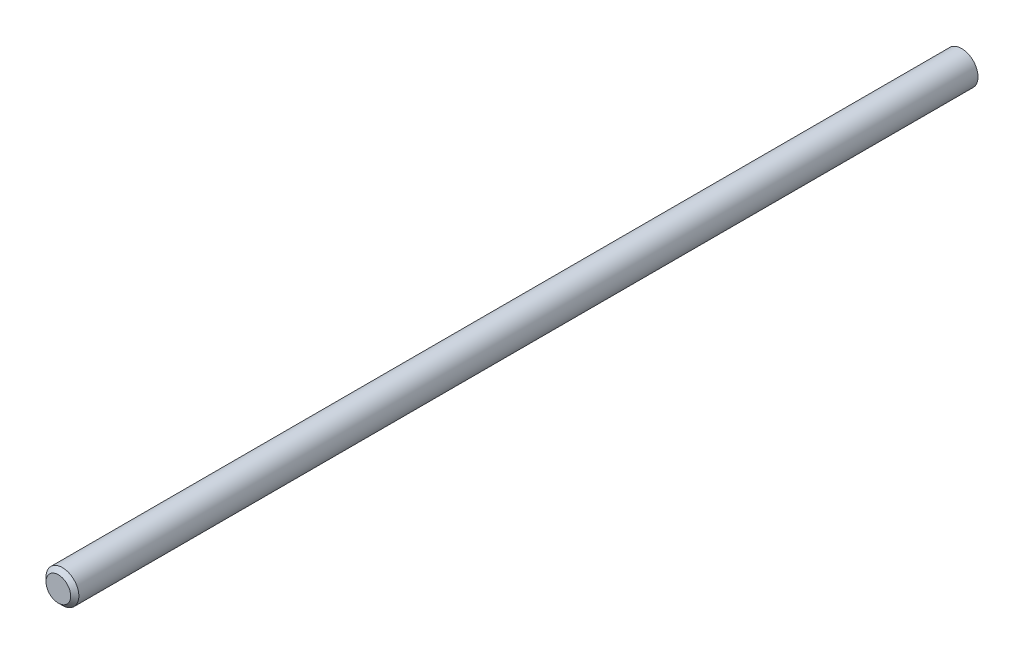
ISO-10303-21;
HEADER;
FILE_DESCRIPTION(('STEP AP214'),'2;1');
FILE_NAME('part.step','',(''),(''),'','','');
FILE_SCHEMA(('AUTOMOTIVE_DESIGN { 1 0 10303 214 1 1 1 1 }'));
ENDSEC;
DATA;
#1=APPLICATION_CONTEXT('core data for automotive mechanical design processes');
#2=APPLICATION_PROTOCOL_DEFINITION('international standard','automotive_design',2000,#1);
#3=PRODUCT_CONTEXT('',#1,'mechanical');
#4=PRODUCT('Part','Part','',(#3));
#5=PRODUCT_RELATED_PRODUCT_CATEGORY('part','',(#4));
#6=PRODUCT_DEFINITION_FORMATION('','',#4);
#7=PRODUCT_DEFINITION_CONTEXT('part definition',#1,'design');
#8=PRODUCT_DEFINITION('design','',#6,#7);
#9=PRODUCT_DEFINITION_SHAPE('','',#8);
#10=(LENGTH_UNIT() NAMED_UNIT(*) SI_UNIT(.MILLI.,.METRE.));
#11=(NAMED_UNIT(*) PLANE_ANGLE_UNIT() SI_UNIT($,.RADIAN.));
#12=(NAMED_UNIT(*) SI_UNIT($,.STERADIAN.) SOLID_ANGLE_UNIT());
#13=UNCERTAINTY_MEASURE_WITH_UNIT(LENGTH_MEASURE(1.E-05),#10,'distance_accuracy_value','');
#14=(GEOMETRIC_REPRESENTATION_CONTEXT(3) GLOBAL_UNCERTAINTY_ASSIGNED_CONTEXT((#13)) GLOBAL_UNIT_ASSIGNED_CONTEXT((#10,
#11,#12)) REPRESENTATION_CONTEXT('',''));
#15=CARTESIAN_POINT('',(0.,0.,0.));
#16=DIRECTION('',(0.,0.,1.));
#17=DIRECTION('',(1.,0.,0.));
#18=AXIS2_PLACEMENT_3D('',#15,#16,#17);
#19=CARTESIAN_POINT('',(0.,0.,220.));
#20=DIRECTION('',(0.,0.,-1.));
#21=DIRECTION('',(-1.,0.,0.));
#22=AXIS2_PLACEMENT_3D('',#19,#20,#21);
#23=CYLINDRICAL_SURFACE('',#22,4.);
#24=CARTESIAN_POINT('',(0.,0.,219.));
#25=DIRECTION('',(0.,0.,1.));
#26=DIRECTION('',(1.,0.,0.));
#27=AXIS2_PLACEMENT_3D('',#24,#25,#26);
#28=CIRCLE('',#27,4.);
#29=CARTESIAN_POINT('',(4.,0.,219.));
#30=VERTEX_POINT('',#29);
#31=EDGE_CURVE('E10',#30,#30,#28,.F.);
#32=ORIENTED_EDGE('',*,*,#31,.T.);
#33=EDGE_LOOP('',(#32));
#34=FACE_BOUND('',#33,.T.);
#35=CARTESIAN_POINT('',(0.,0.,0.));
#36=DIRECTION('',(0.,0.,1.));
#37=DIRECTION('',(1.,0.,0.));
#38=AXIS2_PLACEMENT_3D('',#35,#36,#37);
#39=CIRCLE('',#38,4.);
#40=CARTESIAN_POINT('',(4.,0.,0.));
#41=VERTEX_POINT('',#40);
#42=EDGE_CURVE('E46',#41,#41,#39,.T.);
#43=ORIENTED_EDGE('',*,*,#42,.T.);
#44=EDGE_LOOP('',(#43));
#45=FACE_BOUND('',#44,.T.);
#46=ADVANCED_FACE('F34',(#34,#45),#23,.T.);
#47=CARTESIAN_POINT('',(0.,0.,220.));
#48=DIRECTION('',(0.,0.,1.));
#49=DIRECTION('',(1.,0.,0.));
#50=AXIS2_PLACEMENT_3D('',#47,#48,#49);
#51=PLANE('',#50);
#52=CARTESIAN_POINT('',(0.,0.,220.));
#53=DIRECTION('',(0.,0.,1.));
#54=DIRECTION('',(1.,0.,0.));
#55=AXIS2_PLACEMENT_3D('',#52,#53,#54);
#56=CIRCLE('',#55,3.00000000000003);
#57=CARTESIAN_POINT('',(3.00000000000003,0.,220.));
#58=VERTEX_POINT('',#57);
#59=EDGE_CURVE('E42',#58,#58,#56,.T.);
#60=ORIENTED_EDGE('',*,*,#59,.T.);
#61=EDGE_LOOP('',(#60));
#62=FACE_BOUND('',#61,.T.);
#63=ADVANCED_FACE('F56',(#62),#51,.T.);
#64=CARTESIAN_POINT('',(0.,0.,0.));
#65=DIRECTION('',(0.,0.,1.));
#66=DIRECTION('',(1.,0.,0.));
#67=AXIS2_PLACEMENT_3D('',#64,#65,#66);
#68=PLANE('',#67);
#69=ORIENTED_EDGE('',*,*,#42,.F.);
#70=EDGE_LOOP('',(#69));
#71=FACE_BOUND('',#70,.T.);
#72=ADVANCED_FACE('F54',(#71),#68,.F.);
#73=CARTESIAN_POINT('',(0.,0.,220.));
#74=DIRECTION('',(0.,0.,-1.));
#75=DIRECTION('',(-1.,0.,0.));
#76=AXIS2_PLACEMENT_3D('',#73,#74,#75);
#77=CONICAL_SURFACE('',#76,3.00000000000003,0.785398163397447);
#78=ORIENTED_EDGE('',*,*,#31,.F.);
#79=EDGE_LOOP('',(#78));
#80=FACE_BOUND('',#79,.T.);
#81=ORIENTED_EDGE('',*,*,#59,.F.);
#82=EDGE_LOOP('',(#81));
#83=FACE_BOUND('',#82,.T.);
#84=ADVANCED_FACE('F37',(#80,#83),#77,.T.);
#85=CLOSED_SHELL('',(#46,#63,#72,#84));
#86=MANIFOLD_SOLID_BREP('B2',#85);
#87=ADVANCED_BREP_SHAPE_REPRESENTATION('',(#18,#86),#14);
#88=SHAPE_DEFINITION_REPRESENTATION(#9,#87);
ENDSEC;
END-ISO-10303-21;
